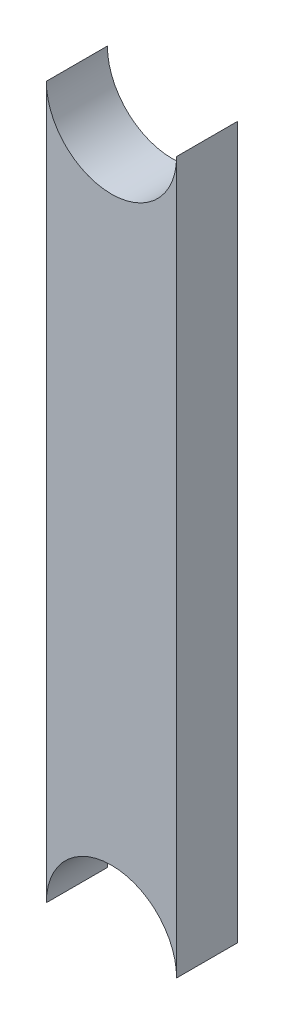
ISO-10303-21;
HEADER;
FILE_DESCRIPTION(('STEP AP214'),'2;1');
FILE_NAME('part.step','',(''),(''),'','','');
FILE_SCHEMA(('AUTOMOTIVE_DESIGN { 1 0 10303 214 1 1 1 1 }'));
ENDSEC;
DATA;
#1=APPLICATION_CONTEXT('core data for automotive mechanical design processes');
#2=APPLICATION_PROTOCOL_DEFINITION('international standard','automotive_design',2000,#1);
#3=PRODUCT_CONTEXT('',#1,'mechanical');
#4=PRODUCT('Part','Part','',(#3));
#5=PRODUCT_RELATED_PRODUCT_CATEGORY('part','',(#4));
#6=PRODUCT_DEFINITION_FORMATION('','',#4);
#7=PRODUCT_DEFINITION_CONTEXT('part definition',#1,'design');
#8=PRODUCT_DEFINITION('design','',#6,#7);
#9=PRODUCT_DEFINITION_SHAPE('','',#8);
#10=(LENGTH_UNIT() NAMED_UNIT(*) SI_UNIT(.MILLI.,.METRE.));
#11=(NAMED_UNIT(*) PLANE_ANGLE_UNIT() SI_UNIT($,.RADIAN.));
#12=(NAMED_UNIT(*) SI_UNIT($,.STERADIAN.) SOLID_ANGLE_UNIT());
#13=UNCERTAINTY_MEASURE_WITH_UNIT(LENGTH_MEASURE(1.E-05),#10,'distance_accuracy_value','');
#14=(GEOMETRIC_REPRESENTATION_CONTEXT(3) GLOBAL_UNCERTAINTY_ASSIGNED_CONTEXT((#13)) GLOBAL_UNIT_ASSIGNED_CONTEXT((#10,
#11,#12)) REPRESENTATION_CONTEXT('',''));
#15=CARTESIAN_POINT('',(0.,0.,0.));
#16=DIRECTION('',(0.,0.,1.));
#17=DIRECTION('',(1.,0.,0.));
#18=AXIS2_PLACEMENT_3D('',#15,#16,#17);
#19=CARTESIAN_POINT('',(0.,34.9448,3.));
#20=DIRECTION('',(0.,0.,-1.));
#21=DIRECTION('',(-1.,0.,0.));
#22=AXIS2_PLACEMENT_3D('',#19,#20,#21);
#23=CYLINDRICAL_SURFACE('',#22,3.2);
#24=CARTESIAN_POINT('',(0.,34.9448,0.));
#25=DIRECTION('',(0.,0.,-1.));
#26=DIRECTION('',(1.,0.,0.));
#27=AXIS2_PLACEMENT_3D('',#24,#25,#26);
#28=CIRCLE('',#27,3.2);
#29=CARTESIAN_POINT('',(3.2,34.9448,0.));
#30=VERTEX_POINT('',#29);
#31=CARTESIAN_POINT('',(-3.2,34.9448,0.));
#32=VERTEX_POINT('',#31);
#33=EDGE_CURVE('E104',#30,#32,#28,.T.);
#34=ORIENTED_EDGE('',*,*,#33,.T.);
#35=DIRECTION('',(0.,0.,-1.));
#36=VECTOR('',#35,1.);
#37=CARTESIAN_POINT('',(-3.2,34.9448,3.));
#38=LINE('',#37,#36);
#39=CARTESIAN_POINT('',(-3.2,34.9448,3.));
#40=VERTEX_POINT('',#39);
#41=EDGE_CURVE('E11',#40,#32,#38,.T.);
#42=ORIENTED_EDGE('',*,*,#41,.F.);
#43=CARTESIAN_POINT('',(0.,34.9448,3.));
#44=DIRECTION('',(0.,0.,-1.));
#45=DIRECTION('',(1.,0.,0.));
#46=AXIS2_PLACEMENT_3D('',#43,#44,#45);
#47=CIRCLE('',#46,3.2);
#48=CARTESIAN_POINT('',(3.2,34.9448,3.));
#49=VERTEX_POINT('',#48);
#50=EDGE_CURVE('E92',#49,#40,#47,.T.);
#51=ORIENTED_EDGE('',*,*,#50,.F.);
#52=DIRECTION('',(0.,0.,-1.));
#53=VECTOR('',#52,1.);
#54=CARTESIAN_POINT('',(3.2,34.9448,3.));
#55=LINE('',#54,#53);
#56=EDGE_CURVE('E100',#49,#30,#55,.T.);
#57=ORIENTED_EDGE('',*,*,#56,.T.);
#58=EDGE_LOOP('',(#34,#42,#51,#57));
#59=FACE_BOUND('',#58,.T.);
#60=ADVANCED_FACE('F41',(#59),#23,.F.);
#61=CARTESIAN_POINT('',(-3.2,0.,3.));
#62=DIRECTION('',(1.,0.,0.));
#63=DIRECTION('',(0.,1.,0.));
#64=AXIS2_PLACEMENT_3D('',#61,#62,#63);
#65=PLANE('',#64);
#66=DIRECTION('',(0.,-1.,0.));
#67=VECTOR('',#66,1.);
#68=CARTESIAN_POINT('',(-3.2,0.,0.));
#69=LINE('',#68,#67);
#70=CARTESIAN_POINT('',(-3.2,0.,0.));
#71=VERTEX_POINT('',#70);
#72=EDGE_CURVE('E96',#32,#71,#69,.T.);
#73=ORIENTED_EDGE('',*,*,#72,.T.);
#74=DIRECTION('',(0.,0.,-1.));
#75=VECTOR('',#74,1.);
#76=CARTESIAN_POINT('',(-3.2,0.,3.));
#77=LINE('',#76,#75);
#78=CARTESIAN_POINT('',(-3.2,0.,3.));
#79=VERTEX_POINT('',#78);
#80=EDGE_CURVE('E49',#79,#71,#77,.T.);
#81=ORIENTED_EDGE('',*,*,#80,.F.);
#82=DIRECTION('',(0.,-1.,0.));
#83=VECTOR('',#82,1.);
#84=CARTESIAN_POINT('',(-3.2,0.,3.));
#85=LINE('',#84,#83);
#86=EDGE_CURVE('E87',#40,#79,#85,.T.);
#87=ORIENTED_EDGE('',*,*,#86,.F.);
#88=ORIENTED_EDGE('',*,*,#41,.T.);
#89=EDGE_LOOP('',(#73,#81,#87,#88));
#90=FACE_BOUND('',#89,.T.);
#91=ADVANCED_FACE('F95',(#90),#65,.F.);
#92=CARTESIAN_POINT('',(0.,0.,3.));
#93=DIRECTION('',(0.,0.,-1.));
#94=DIRECTION('',(-1.,0.,0.));
#95=AXIS2_PLACEMENT_3D('',#92,#93,#94);
#96=CYLINDRICAL_SURFACE('',#95,3.2);
#97=CARTESIAN_POINT('',(0.,0.,0.));
#98=DIRECTION('',(0.,0.,-1.));
#99=DIRECTION('',(1.,0.,0.));
#100=AXIS2_PLACEMENT_3D('',#97,#98,#99);
#101=CIRCLE('',#100,3.2);
#102=CARTESIAN_POINT('',(3.2,0.,0.));
#103=VERTEX_POINT('',#102);
#104=EDGE_CURVE('E74',#71,#103,#101,.T.);
#105=ORIENTED_EDGE('',*,*,#104,.T.);
#106=DIRECTION('',(0.,0.,-1.));
#107=VECTOR('',#106,1.);
#108=CARTESIAN_POINT('',(3.2,0.,3.));
#109=LINE('',#108,#107);
#110=CARTESIAN_POINT('',(3.2,0.,3.));
#111=VERTEX_POINT('',#110);
#112=EDGE_CURVE('E97',#111,#103,#109,.T.);
#113=ORIENTED_EDGE('',*,*,#112,.F.);
#114=CARTESIAN_POINT('',(0.,0.,3.));
#115=DIRECTION('',(0.,0.,-1.));
#116=DIRECTION('',(1.,0.,0.));
#117=AXIS2_PLACEMENT_3D('',#114,#115,#116);
#118=CIRCLE('',#117,3.2);
#119=EDGE_CURVE('E90',#79,#111,#118,.T.);
#120=ORIENTED_EDGE('',*,*,#119,.F.);
#121=ORIENTED_EDGE('',*,*,#80,.T.);
#122=EDGE_LOOP('',(#105,#113,#120,#121));
#123=FACE_BOUND('',#122,.T.);
#124=ADVANCED_FACE('F98',(#123),#96,.F.);
#125=CARTESIAN_POINT('',(3.2,34.9448,3.));
#126=DIRECTION('',(-1.,0.,0.));
#127=DIRECTION('',(0.,-1.,0.));
#128=AXIS2_PLACEMENT_3D('',#125,#126,#127);
#129=PLANE('',#128);
#130=DIRECTION('',(0.,1.,0.));
#131=VECTOR('',#130,1.);
#132=CARTESIAN_POINT('',(3.2,34.9448,0.));
#133=LINE('',#132,#131);
#134=EDGE_CURVE('E80',#103,#30,#133,.T.);
#135=ORIENTED_EDGE('',*,*,#134,.T.);
#136=ORIENTED_EDGE('',*,*,#56,.F.);
#137=DIRECTION('',(0.,1.,0.));
#138=VECTOR('',#137,1.);
#139=CARTESIAN_POINT('',(3.2,34.9448,3.));
#140=LINE('',#139,#138);
#141=EDGE_CURVE('E57',#111,#49,#140,.T.);
#142=ORIENTED_EDGE('',*,*,#141,.F.);
#143=ORIENTED_EDGE('',*,*,#112,.T.);
#144=EDGE_LOOP('',(#135,#136,#142,#143));
#145=FACE_BOUND('',#144,.T.);
#146=ADVANCED_FACE('F111',(#145),#129,.F.);
#147=CARTESIAN_POINT('',(0.,34.9448,3.));
#148=DIRECTION('',(0.,0.,1.));
#149=DIRECTION('',(1.,0.,0.));
#150=AXIS2_PLACEMENT_3D('',#147,#148,#149);
#151=PLANE('',#150);
#152=ORIENTED_EDGE('',*,*,#50,.T.);
#153=ORIENTED_EDGE('',*,*,#86,.T.);
#154=ORIENTED_EDGE('',*,*,#119,.T.);
#155=ORIENTED_EDGE('',*,*,#141,.T.);
#156=EDGE_LOOP('',(#152,#153,#154,#155));
#157=FACE_BOUND('',#156,.T.);
#158=ADVANCED_FACE('F88',(#157),#151,.T.);
#159=CARTESIAN_POINT('',(0.,34.9448,0.));
#160=DIRECTION('',(0.,0.,1.));
#161=DIRECTION('',(1.,0.,0.));
#162=AXIS2_PLACEMENT_3D('',#159,#160,#161);
#163=PLANE('',#162);
#164=ORIENTED_EDGE('',*,*,#33,.F.);
#165=ORIENTED_EDGE('',*,*,#134,.F.);
#166=ORIENTED_EDGE('',*,*,#104,.F.);
#167=ORIENTED_EDGE('',*,*,#72,.F.);
#168=EDGE_LOOP('',(#164,#165,#166,#167));
#169=FACE_BOUND('',#168,.T.);
#170=ADVANCED_FACE('F114',(#169),#163,.F.);
#171=CLOSED_SHELL('',(#60,#91,#124,#146,#158,#170));
#172=MANIFOLD_SOLID_BREP('B2',#171);
#173=ADVANCED_BREP_SHAPE_REPRESENTATION('',(#18,#172),#14);
#174=SHAPE_DEFINITION_REPRESENTATION(#9,#173);
ENDSEC;
END-ISO-10303-21;
